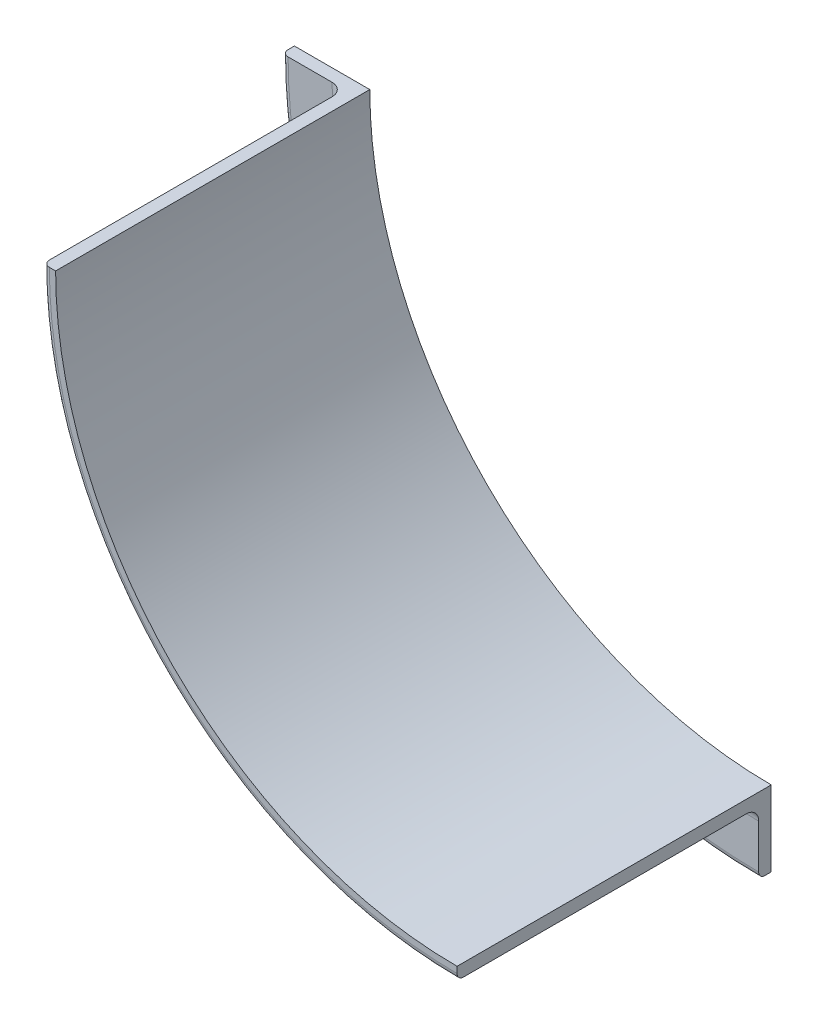
ISO-10303-21;
HEADER;
FILE_DESCRIPTION(('STEP AP214'),'2;1');
FILE_NAME('part.step','',(''),(''),'','','');
FILE_SCHEMA(('AUTOMOTIVE_DESIGN { 1 0 10303 214 1 1 1 1 }'));
ENDSEC;
DATA;
#1=APPLICATION_CONTEXT('core data for automotive mechanical design processes');
#2=APPLICATION_PROTOCOL_DEFINITION('international standard','automotive_design',2000,#1);
#3=PRODUCT_CONTEXT('',#1,'mechanical');
#4=PRODUCT('Part','Part','',(#3));
#5=PRODUCT_RELATED_PRODUCT_CATEGORY('part','',(#4));
#6=PRODUCT_DEFINITION_FORMATION('','',#4);
#7=PRODUCT_DEFINITION_CONTEXT('part definition',#1,'design');
#8=PRODUCT_DEFINITION('design','',#6,#7);
#9=PRODUCT_DEFINITION_SHAPE('','',#8);
#10=(LENGTH_UNIT() NAMED_UNIT(*) SI_UNIT(.MILLI.,.METRE.));
#11=(NAMED_UNIT(*) PLANE_ANGLE_UNIT() SI_UNIT($,.RADIAN.));
#12=(NAMED_UNIT(*) SI_UNIT($,.STERADIAN.) SOLID_ANGLE_UNIT());
#13=UNCERTAINTY_MEASURE_WITH_UNIT(LENGTH_MEASURE(1.E-05),#10,'distance_accuracy_value','');
#14=(GEOMETRIC_REPRESENTATION_CONTEXT(3) GLOBAL_UNCERTAINTY_ASSIGNED_CONTEXT((#13)) GLOBAL_UNIT_ASSIGNED_CONTEXT((#10,
#11,#12)) REPRESENTATION_CONTEXT('',''));
#15=CARTESIAN_POINT('',(0.,0.,0.));
#16=DIRECTION('',(0.,0.,1.));
#17=DIRECTION('',(1.,0.,0.));
#18=AXIS2_PLACEMENT_3D('',#15,#16,#17);
#19=CARTESIAN_POINT('',(2822.85812694373,-672.549477123745,50.));
#20=DIRECTION('',(0.,0.,-1.));
#21=DIRECTION('',(-1.,0.,0.));
#22=AXIS2_PLACEMENT_3D('',#19,#20,#21);
#23=CYLINDRICAL_SURFACE('',#22,75.8900000000001);
#24=DIRECTION('',(0.,0.,-1.));
#25=VECTOR('',#24,1.);
#26=CARTESIAN_POINT('',(2822.85812694373,-748.439477123745,50.));
#27=LINE('',#26,#25);
#28=CARTESIAN_POINT('',(2822.85812694373,-748.439477123745,1.));
#29=VERTEX_POINT('',#28);
#30=CARTESIAN_POINT('',(2822.85812694373,-748.439477123745,0.));
#31=VERTEX_POINT('',#30);
#32=EDGE_CURVE('E133',#29,#31,#27,.T.);
#33=ORIENTED_EDGE('',*,*,#32,.F.);
#34=CARTESIAN_POINT('',(2822.85812694373,-672.549477123745,1.));
#35=DIRECTION('',(0.,0.,1.));
#36=DIRECTION('',(1.,0.,0.));
#37=AXIS2_PLACEMENT_3D('',#34,#35,#36);
#38=CIRCLE('',#37,75.8900000000001);
#39=CARTESIAN_POINT('',(2746.96812694373,-672.549477123745,1.));
#40=VERTEX_POINT('',#39);
#41=EDGE_CURVE('E141',#29,#40,#38,.F.);
#42=ORIENTED_EDGE('',*,*,#41,.T.);
#43=DIRECTION('',(0.,0.,-1.));
#44=VECTOR('',#43,1.);
#45=CARTESIAN_POINT('',(2746.96812694373,-672.549477123745,50.));
#46=LINE('',#45,#44);
#47=CARTESIAN_POINT('',(2746.96812694373,-672.549477123745,0.));
#48=VERTEX_POINT('',#47);
#49=EDGE_CURVE('E128',#40,#48,#46,.T.);
#50=ORIENTED_EDGE('',*,*,#49,.T.);
#51=CARTESIAN_POINT('',(2822.85812694373,-672.549477123745,0.));
#52=DIRECTION('',(0.,0.,1.));
#53=DIRECTION('',(1.,0.,0.));
#54=AXIS2_PLACEMENT_3D('',#51,#52,#53);
#55=CIRCLE('',#54,75.8900000000001);
#56=EDGE_CURVE('E185',#48,#31,#55,.T.);
#57=ORIENTED_EDGE('',*,*,#56,.T.);
#58=EDGE_LOOP('',(#33,#42,#50,#57));
#59=FACE_BOUND('',#58,.T.);
#60=ADVANCED_FACE('F33',(#59),#23,.T.);
#61=CARTESIAN_POINT('',(2822.85812694373,-672.549477123745,50.));
#62=DIRECTION('',(0.,0.,-1.));
#63=DIRECTION('',(-1.,0.,0.));
#64=AXIS2_PLACEMENT_3D('',#61,#62,#63);
#65=CYLINDRICAL_SURFACE('',#64,63.8900000000001);
#66=CARTESIAN_POINT('',(2822.85812694373,-672.549477123745,0.));
#67=DIRECTION('',(0.,0.,-1.));
#68=DIRECTION('',(1.,0.,0.));
#69=AXIS2_PLACEMENT_3D('',#66,#67,#68);
#70=CIRCLE('',#69,63.8900000000001);
#71=CARTESIAN_POINT('',(2822.85812694373,-736.439477123745,0.));
#72=VERTEX_POINT('',#71);
#73=CARTESIAN_POINT('',(2758.96812694373,-672.549477123745,0.));
#74=VERTEX_POINT('',#73);
#75=EDGE_CURVE('E126',#72,#74,#70,.T.);
#76=ORIENTED_EDGE('',*,*,#75,.T.);
#77=DIRECTION('',(0.,0.,-1.));
#78=VECTOR('',#77,1.);
#79=CARTESIAN_POINT('',(2758.96812694373,-672.549477123745,50.));
#80=LINE('',#79,#78);
#81=CARTESIAN_POINT('',(2758.96812694373,-672.549477123745,50.));
#82=VERTEX_POINT('',#81);
#83=EDGE_CURVE('E107',#82,#74,#80,.T.);
#84=ORIENTED_EDGE('',*,*,#83,.F.);
#85=CARTESIAN_POINT('',(2822.85812694373,-672.549477123745,50.));
#86=DIRECTION('',(0.,0.,-1.));
#87=DIRECTION('',(1.,0.,0.));
#88=AXIS2_PLACEMENT_3D('',#85,#86,#87);
#89=CIRCLE('',#88,63.8900000000001);
#90=CARTESIAN_POINT('',(2822.85812694373,-736.439477123745,50.));
#91=VERTEX_POINT('',#90);
#92=EDGE_CURVE('E114',#91,#82,#89,.T.);
#93=ORIENTED_EDGE('',*,*,#92,.F.);
#94=DIRECTION('',(0.,0.,-1.));
#95=VECTOR('',#94,1.);
#96=CARTESIAN_POINT('',(2822.85812694373,-736.439477123745,50.));
#97=LINE('',#96,#95);
#98=EDGE_CURVE('E181',#91,#72,#97,.T.);
#99=ORIENTED_EDGE('',*,*,#98,.T.);
#100=EDGE_LOOP('',(#76,#84,#93,#99));
#101=FACE_BOUND('',#100,.T.);
#102=ADVANCED_FACE('F124',(#101),#65,.F.);
#103=CARTESIAN_POINT('',(2758.96812694373,-672.549477123745,50.));
#104=DIRECTION('',(0.,-1.,0.));
#105=DIRECTION('',(0.,0.,-1.));
#106=AXIS2_PLACEMENT_3D('',#103,#104,#105);
#107=PLANE('',#106);
#108=ORIENTED_EDGE('',*,*,#49,.F.);
#109=CARTESIAN_POINT('',(2747.96812694373,-672.549477123745,1.));
#110=DIRECTION('',(0.,-1.,0.));
#111=DIRECTION('',(0.,0.,-1.));
#112=AXIS2_PLACEMENT_3D('',#109,#110,#111);
#113=CIRCLE('',#112,1.);
#114=CARTESIAN_POINT('',(2747.96812694373,-672.549477123745,2.));
#115=VERTEX_POINT('',#114);
#116=EDGE_CURVE('E144',#40,#115,#113,.F.);
#117=ORIENTED_EDGE('',*,*,#116,.T.);
#118=DIRECTION('',(-1.,0.,0.));
#119=VECTOR('',#118,1.);
#120=CARTESIAN_POINT('',(2756.96812694373,-672.549477123745,2.));
#121=LINE('',#120,#119);
#122=CARTESIAN_POINT('',(2754.96812694373,-672.549477123745,2.));
#123=VERTEX_POINT('',#122);
#124=EDGE_CURVE('E159',#123,#115,#121,.T.);
#125=ORIENTED_EDGE('',*,*,#124,.F.);
#126=CARTESIAN_POINT('',(2754.96812694373,-672.549477123745,4.));
#127=DIRECTION('',(0.,-1.,0.));
#128=DIRECTION('',(0.,0.,-1.));
#129=AXIS2_PLACEMENT_3D('',#126,#127,#128);
#130=CIRCLE('',#129,2.);
#131=CARTESIAN_POINT('',(2756.96812694373,-672.549477123745,4.));
#132=VERTEX_POINT('',#131);
#133=EDGE_CURVE('E41',#123,#132,#130,.T.);
#134=ORIENTED_EDGE('',*,*,#133,.T.);
#135=DIRECTION('',(0.,0.,1.));
#136=VECTOR('',#135,1.);
#137=CARTESIAN_POINT('',(2756.96812694373,-672.549477123745,2.));
#138=LINE('',#137,#136);
#139=CARTESIAN_POINT('',(2756.96812694373,-672.549477123745,49.));
#140=VERTEX_POINT('',#139);
#141=EDGE_CURVE('E168',#132,#140,#138,.T.);
#142=ORIENTED_EDGE('',*,*,#141,.T.);
#143=CARTESIAN_POINT('',(2757.96812694373,-672.549477123745,49.));
#144=DIRECTION('',(0.,-1.,0.));
#145=DIRECTION('',(0.,0.,-1.));
#146=AXIS2_PLACEMENT_3D('',#143,#144,#145);
#147=CIRCLE('',#146,1.);
#148=CARTESIAN_POINT('',(2757.96812694373,-672.549477123745,50.));
#149=VERTEX_POINT('',#148);
#150=EDGE_CURVE('E110',#140,#149,#147,.F.);
#151=ORIENTED_EDGE('',*,*,#150,.T.);
#152=DIRECTION('',(-1.,0.,0.));
#153=VECTOR('',#152,1.);
#154=CARTESIAN_POINT('',(2758.96812694373,-672.549477123745,50.));
#155=LINE('',#154,#153);
#156=EDGE_CURVE('E101',#82,#149,#155,.T.);
#157=ORIENTED_EDGE('',*,*,#156,.F.);
#158=ORIENTED_EDGE('',*,*,#83,.T.);
#159=DIRECTION('',(-1.,0.,0.));
#160=VECTOR('',#159,1.);
#161=CARTESIAN_POINT('',(2758.96812694373,-672.549477123745,0.));
#162=LINE('',#161,#160);
#163=EDGE_CURVE('E183',#74,#48,#162,.T.);
#164=ORIENTED_EDGE('',*,*,#163,.T.);
#165=EDGE_LOOP('',(#108,#117,#125,#134,#142,#151,#157,#158,#164));
#166=FACE_BOUND('',#165,.T.);
#167=ADVANCED_FACE('F104',(#166),#107,.F.);
#168=CARTESIAN_POINT('',(2822.85812694373,-736.439477123745,50.));
#169=DIRECTION('',(-1.,0.,0.));
#170=DIRECTION('',(0.,0.,1.));
#171=AXIS2_PLACEMENT_3D('',#168,#169,#170);
#172=PLANE('',#171);
#173=DIRECTION('',(0.,1.,0.));
#174=VECTOR('',#173,1.);
#175=CARTESIAN_POINT('',(2822.85812694373,-757.577335173901,2.));
#176=LINE('',#175,#174);
#177=CARTESIAN_POINT('',(2822.85812694373,-747.439477123745,2.));
#178=VERTEX_POINT('',#177);
#179=CARTESIAN_POINT('',(2822.85812694373,-740.439477123745,2.));
#180=VERTEX_POINT('',#179);
#181=EDGE_CURVE('E161',#178,#180,#176,.T.);
#182=ORIENTED_EDGE('',*,*,#181,.F.);
#183=CARTESIAN_POINT('',(2822.85812694373,-747.439477123745,1.));
#184=DIRECTION('',(-1.,0.,0.));
#185=DIRECTION('',(0.,0.,1.));
#186=AXIS2_PLACEMENT_3D('',#183,#184,#185);
#187=CIRCLE('',#186,1.);
#188=EDGE_CURVE('E139',#178,#29,#187,.F.);
#189=ORIENTED_EDGE('',*,*,#188,.T.);
#190=ORIENTED_EDGE('',*,*,#32,.T.);
#191=DIRECTION('',(0.,1.,0.));
#192=VECTOR('',#191,1.);
#193=CARTESIAN_POINT('',(2822.85812694373,-736.439477123745,0.));
#194=LINE('',#193,#192);
#195=EDGE_CURVE('E122',#31,#72,#194,.T.);
#196=ORIENTED_EDGE('',*,*,#195,.T.);
#197=ORIENTED_EDGE('',*,*,#98,.F.);
#198=DIRECTION('',(0.,1.,0.));
#199=VECTOR('',#198,1.);
#200=CARTESIAN_POINT('',(2822.85812694373,-736.439477123745,50.));
#201=LINE('',#200,#199);
#202=CARTESIAN_POINT('',(2822.85812694373,-737.439477123745,50.));
#203=VERTEX_POINT('',#202);
#204=EDGE_CURVE('E113',#203,#91,#201,.T.);
#205=ORIENTED_EDGE('',*,*,#204,.F.);
#206=CARTESIAN_POINT('',(2822.85812694373,-737.439477123745,49.));
#207=DIRECTION('',(-1.,0.,0.));
#208=DIRECTION('',(0.,0.,1.));
#209=AXIS2_PLACEMENT_3D('',#206,#207,#208);
#210=CIRCLE('',#209,1.);
#211=CARTESIAN_POINT('',(2822.85812694373,-738.439477123745,49.));
#212=VERTEX_POINT('',#211);
#213=EDGE_CURVE('E131',#203,#212,#210,.F.);
#214=ORIENTED_EDGE('',*,*,#213,.T.);
#215=DIRECTION('',(0.,0.,1.));
#216=VECTOR('',#215,1.);
#217=CARTESIAN_POINT('',(2822.85812694373,-738.439477123745,2.));
#218=LINE('',#217,#216);
#219=CARTESIAN_POINT('',(2822.85812694373,-738.439477123745,4.));
#220=VERTEX_POINT('',#219);
#221=EDGE_CURVE('E177',#220,#212,#218,.T.);
#222=ORIENTED_EDGE('',*,*,#221,.F.);
#223=CARTESIAN_POINT('',(2822.85812694373,-740.439477123745,4.));
#224=DIRECTION('',(-1.,0.,0.));
#225=DIRECTION('',(0.,0.,1.));
#226=AXIS2_PLACEMENT_3D('',#223,#224,#225);
#227=CIRCLE('',#226,2.);
#228=EDGE_CURVE('E11',#220,#180,#227,.T.);
#229=ORIENTED_EDGE('',*,*,#228,.T.);
#230=EDGE_LOOP('',(#182,#189,#190,#196,#197,#205,#214,#222,#229));
#231=FACE_BOUND('',#230,.T.);
#232=ADVANCED_FACE('F191',(#231),#172,.F.);
#233=CARTESIAN_POINT('',(2822.85812694373,-672.549477123745,50.));
#234=DIRECTION('',(0.,0.,1.));
#235=DIRECTION('',(1.,0.,0.));
#236=AXIS2_PLACEMENT_3D('',#233,#234,#235);
#237=PLANE('',#236);
#238=ORIENTED_EDGE('',*,*,#156,.T.);
#239=CARTESIAN_POINT('',(2822.85812694373,-672.549477123745,50.));
#240=DIRECTION('',(0.,0.,1.));
#241=DIRECTION('',(1.,0.,0.));
#242=AXIS2_PLACEMENT_3D('',#239,#240,#241);
#243=CIRCLE('',#242,64.89);
#244=EDGE_CURVE('E150',#149,#203,#243,.T.);
#245=ORIENTED_EDGE('',*,*,#244,.T.);
#246=ORIENTED_EDGE('',*,*,#204,.T.);
#247=ORIENTED_EDGE('',*,*,#92,.T.);
#248=EDGE_LOOP('',(#238,#245,#246,#247));
#249=FACE_BOUND('',#248,.T.);
#250=ADVANCED_FACE('F117',(#249),#237,.T.);
#251=CARTESIAN_POINT('',(2822.85812694373,-672.549477123745,0.));
#252=DIRECTION('',(0.,0.,1.));
#253=DIRECTION('',(1.,0.,0.));
#254=AXIS2_PLACEMENT_3D('',#251,#252,#253);
#255=PLANE('',#254);
#256=CARTESIAN_POINT('',(2802.85812694373,-741.080726200352,0.));
#257=DIRECTION('',(0.,0.,1.));
#258=DIRECTION('',(1.,0.,0.));
#259=AXIS2_PLACEMENT_3D('',#256,#257,#258);
#260=CIRCLE('',#259,1.59999999999989);
#261=CARTESIAN_POINT('',(2804.45812694373,-741.080726200352,0.));
#262=VERTEX_POINT('',#261);
#263=EDGE_CURVE('E166',#262,#262,#260,.T.);
#264=ORIENTED_EDGE('',*,*,#263,.T.);
#265=EDGE_LOOP('',(#264));
#266=FACE_BOUND('',#265,.T.);
#267=CARTESIAN_POINT('',(2754.32687786713,-692.549477123745,0.));
#268=DIRECTION('',(0.,0.,1.));
#269=DIRECTION('',(1.,0.,0.));
#270=AXIS2_PLACEMENT_3D('',#267,#268,#269);
#271=CIRCLE('',#270,1.59999999999989);
#272=CARTESIAN_POINT('',(2755.92687786713,-692.549477123745,0.));
#273=VERTEX_POINT('',#272);
#274=EDGE_CURVE('E244',#273,#273,#271,.T.);
#275=ORIENTED_EDGE('',*,*,#274,.T.);
#276=EDGE_LOOP('',(#275));
#277=FACE_BOUND('',#276,.T.);
#278=ORIENTED_EDGE('',*,*,#75,.F.);
#279=ORIENTED_EDGE('',*,*,#195,.F.);
#280=ORIENTED_EDGE('',*,*,#56,.F.);
#281=ORIENTED_EDGE('',*,*,#163,.F.);
#282=EDGE_LOOP('',(#278,#279,#280,#281));
#283=FACE_BOUND('',#282,.T.);
#284=ADVANCED_FACE('F197',(#266,#277,#283),#255,.F.);
#285=CARTESIAN_POINT('',(2822.85812694373,-672.549477123745,2.));
#286=DIRECTION('',(0.,0.,1.));
#287=DIRECTION('',(1.,0.,0.));
#288=AXIS2_PLACEMENT_3D('',#285,#286,#287);
#289=PLANE('',#288);
#290=CARTESIAN_POINT('',(2802.85812694373,-741.080726200352,2.));
#291=DIRECTION('',(0.,0.,1.));
#292=DIRECTION('',(1.,0.,0.));
#293=AXIS2_PLACEMENT_3D('',#290,#291,#292);
#294=CIRCLE('',#293,1.59999999999989);
#295=CARTESIAN_POINT('',(2804.45812694373,-741.080726200352,2.));
#296=VERTEX_POINT('',#295);
#297=EDGE_CURVE('E171',#296,#296,#294,.T.);
#298=ORIENTED_EDGE('',*,*,#297,.F.);
#299=EDGE_LOOP('',(#298));
#300=FACE_BOUND('',#299,.T.);
#301=CARTESIAN_POINT('',(2754.32687786713,-692.549477123745,2.));
#302=DIRECTION('',(0.,0.,1.));
#303=DIRECTION('',(1.,0.,0.));
#304=AXIS2_PLACEMENT_3D('',#301,#302,#303);
#305=CIRCLE('',#304,1.59999999999989);
#306=CARTESIAN_POINT('',(2755.92687786713,-692.549477123745,2.));
#307=VERTEX_POINT('',#306);
#308=EDGE_CURVE('E174',#307,#307,#305,.T.);
#309=ORIENTED_EDGE('',*,*,#308,.F.);
#310=EDGE_LOOP('',(#309));
#311=FACE_BOUND('',#310,.T.);
#312=ORIENTED_EDGE('',*,*,#181,.T.);
#313=CARTESIAN_POINT('',(2822.85812694373,-672.549477123745,2.));
#314=DIRECTION('',(0.,0.,1.));
#315=DIRECTION('',(1.,0.,0.));
#316=AXIS2_PLACEMENT_3D('',#313,#314,#315);
#317=CIRCLE('',#316,67.89);
#318=EDGE_CURVE('E152',#180,#123,#317,.F.);
#319=ORIENTED_EDGE('',*,*,#318,.T.);
#320=ORIENTED_EDGE('',*,*,#124,.T.);
#321=CARTESIAN_POINT('',(2822.85812694373,-672.549477123745,2.));
#322=DIRECTION('',(0.,0.,1.));
#323=DIRECTION('',(1.,0.,0.));
#324=AXIS2_PLACEMENT_3D('',#321,#322,#323);
#325=CIRCLE('',#324,74.8900000000001);
#326=EDGE_CURVE('E127',#115,#178,#325,.T.);
#327=ORIENTED_EDGE('',*,*,#326,.T.);
#328=EDGE_LOOP('',(#312,#319,#320,#327));
#329=FACE_BOUND('',#328,.T.);
#330=ADVANCED_FACE('F158',(#300,#311,#329),#289,.T.);
#331=CARTESIAN_POINT('',(2822.85812694373,-672.549477123745,2.));
#332=DIRECTION('',(0.,0.,1.));
#333=DIRECTION('',(1.,0.,0.));
#334=AXIS2_PLACEMENT_3D('',#331,#332,#333);
#335=CYLINDRICAL_SURFACE('',#334,65.89);
#336=ORIENTED_EDGE('',*,*,#141,.F.);
#337=CARTESIAN_POINT('',(2822.85812694373,-672.549477123745,4.));
#338=DIRECTION('',(0.,0.,1.));
#339=DIRECTION('',(1.,0.,0.));
#340=AXIS2_PLACEMENT_3D('',#337,#338,#339);
#341=CIRCLE('',#340,65.89);
#342=EDGE_CURVE('E54',#132,#220,#341,.T.);
#343=ORIENTED_EDGE('',*,*,#342,.T.);
#344=ORIENTED_EDGE('',*,*,#221,.T.);
#345=CARTESIAN_POINT('',(2822.85812694373,-672.549477123745,49.));
#346=DIRECTION('',(0.,0.,1.));
#347=DIRECTION('',(1.,0.,0.));
#348=AXIS2_PLACEMENT_3D('',#345,#346,#347);
#349=CIRCLE('',#348,65.89);
#350=EDGE_CURVE('E147',#212,#140,#349,.F.);
#351=ORIENTED_EDGE('',*,*,#350,.T.);
#352=EDGE_LOOP('',(#336,#343,#344,#351));
#353=FACE_BOUND('',#352,.T.);
#354=ADVANCED_FACE('F223',(#353),#335,.T.);
#355=CARTESIAN_POINT('',(2822.85812694373,-672.549477123745,1.));
#356=DIRECTION('',(0.,0.,1.));
#357=DIRECTION('',(1.,0.,0.));
#358=AXIS2_PLACEMENT_3D('',#355,#356,#357);
#359=TOROIDAL_SURFACE('',#358,74.8900000000001,1.);
#360=ORIENTED_EDGE('',*,*,#116,.F.);
#361=ORIENTED_EDGE('',*,*,#41,.F.);
#362=ORIENTED_EDGE('',*,*,#188,.F.);
#363=ORIENTED_EDGE('',*,*,#326,.F.);
#364=EDGE_LOOP('',(#360,#361,#362,#363));
#365=FACE_BOUND('',#364,.T.);
#366=ADVANCED_FACE('F199',(#365),#359,.T.);
#367=CARTESIAN_POINT('',(2822.85812694373,-672.549477123745,49.));
#368=DIRECTION('',(0.,0.,1.));
#369=DIRECTION('',(1.,0.,0.));
#370=AXIS2_PLACEMENT_3D('',#367,#368,#369);
#371=TOROIDAL_SURFACE('',#370,64.89,1.);
#372=ORIENTED_EDGE('',*,*,#213,.F.);
#373=ORIENTED_EDGE('',*,*,#244,.F.);
#374=ORIENTED_EDGE('',*,*,#150,.F.);
#375=ORIENTED_EDGE('',*,*,#350,.F.);
#376=EDGE_LOOP('',(#372,#373,#374,#375));
#377=FACE_BOUND('',#376,.T.);
#378=ADVANCED_FACE('F202',(#377),#371,.T.);
#379=CARTESIAN_POINT('',(2822.85812694373,-672.549477123745,4.));
#380=DIRECTION('',(0.,0.,1.));
#381=DIRECTION('',(1.,0.,0.));
#382=AXIS2_PLACEMENT_3D('',#379,#380,#381);
#383=TOROIDAL_SURFACE('',#382,67.89,2.);
#384=ORIENTED_EDGE('',*,*,#228,.F.);
#385=ORIENTED_EDGE('',*,*,#342,.F.);
#386=ORIENTED_EDGE('',*,*,#133,.F.);
#387=ORIENTED_EDGE('',*,*,#318,.F.);
#388=EDGE_LOOP('',(#384,#385,#386,#387));
#389=FACE_BOUND('',#388,.T.);
#390=ADVANCED_FACE('F35',(#389),#383,.F.);
#391=CARTESIAN_POINT('',(2754.32687786713,-692.549477123745,0.));
#392=DIRECTION('',(0.,0.,1.));
#393=DIRECTION('',(1.,0.,0.));
#394=AXIS2_PLACEMENT_3D('',#391,#392,#393);
#395=CYLINDRICAL_SURFACE('',#394,1.59999999999989);
#396=ORIENTED_EDGE('',*,*,#274,.F.);
#397=EDGE_LOOP('',(#396));
#398=FACE_BOUND('',#397,.T.);
#399=ORIENTED_EDGE('',*,*,#308,.T.);
#400=EDGE_LOOP('',(#399));
#401=FACE_BOUND('',#400,.T.);
#402=ADVANCED_FACE('F201',(#398,#401),#395,.F.);
#403=CARTESIAN_POINT('',(2802.85812694373,-741.080726200352,0.));
#404=DIRECTION('',(0.,0.,1.));
#405=DIRECTION('',(1.,0.,0.));
#406=AXIS2_PLACEMENT_3D('',#403,#404,#405);
#407=CYLINDRICAL_SURFACE('',#406,1.59999999999989);
#408=ORIENTED_EDGE('',*,*,#263,.F.);
#409=EDGE_LOOP('',(#408));
#410=FACE_BOUND('',#409,.T.);
#411=ORIENTED_EDGE('',*,*,#297,.T.);
#412=EDGE_LOOP('',(#411));
#413=FACE_BOUND('',#412,.T.);
#414=ADVANCED_FACE('F207',(#410,#413),#407,.F.);
#415=CLOSED_SHELL('',(#60,#102,#167,#232,#250,#284,#330,#354,#366,#378,#390,#402,#414));
#416=MANIFOLD_SOLID_BREP('B2',#415);
#417=ADVANCED_BREP_SHAPE_REPRESENTATION('',(#18,#416),#14);
#418=SHAPE_DEFINITION_REPRESENTATION(#9,#417);
ENDSEC;
END-ISO-10303-21;
